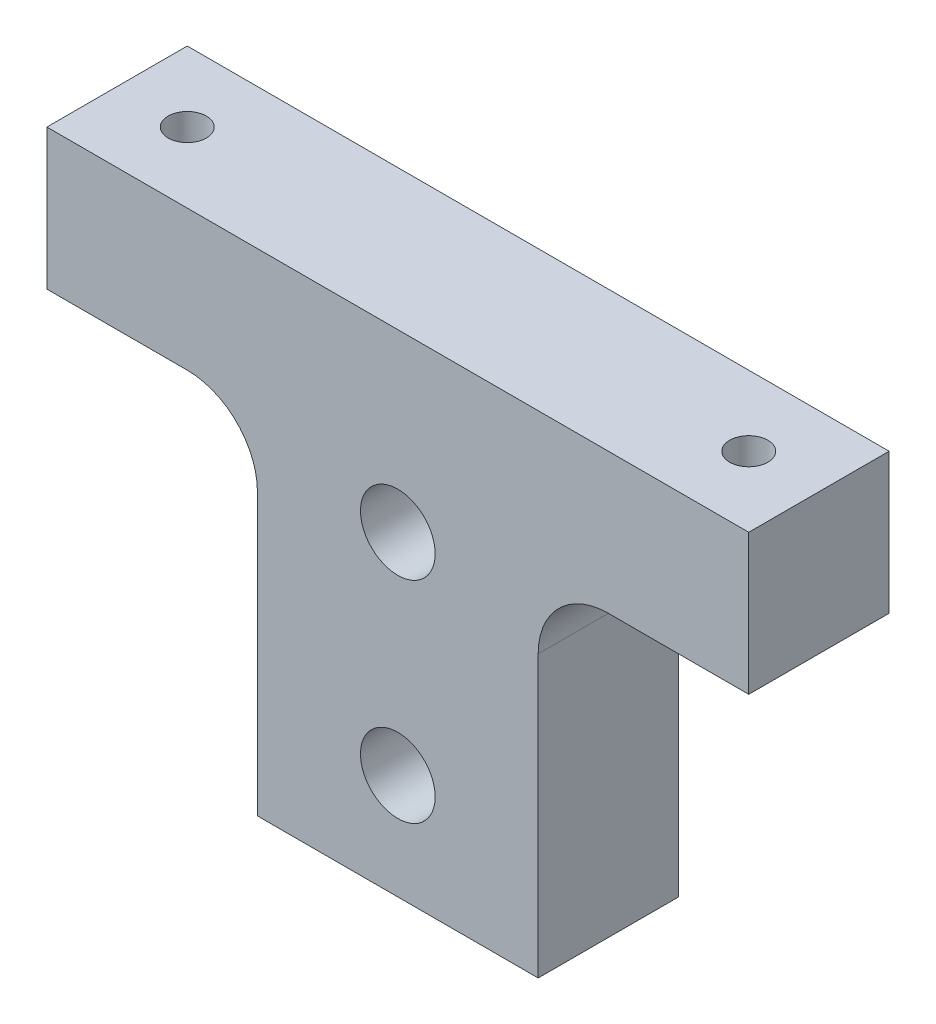
ISO-10303-21;
HEADER;
FILE_DESCRIPTION(('STEP AP214'),'2;1');
FILE_NAME('part.step','',(''),(''),'','','');
FILE_SCHEMA(('AUTOMOTIVE_DESIGN { 1 0 10303 214 1 1 1 1 }'));
ENDSEC;
DATA;
#1=APPLICATION_CONTEXT('core data for automotive mechanical design processes');
#2=APPLICATION_PROTOCOL_DEFINITION('international standard','automotive_design',2000,#1);
#3=PRODUCT_CONTEXT('',#1,'mechanical');
#4=PRODUCT('Part','Part','',(#3));
#5=PRODUCT_RELATED_PRODUCT_CATEGORY('part','',(#4));
#6=PRODUCT_DEFINITION_FORMATION('','',#4);
#7=PRODUCT_DEFINITION_CONTEXT('part definition',#1,'design');
#8=PRODUCT_DEFINITION('design','',#6,#7);
#9=PRODUCT_DEFINITION_SHAPE('','',#8);
#10=(LENGTH_UNIT() NAMED_UNIT(*) SI_UNIT(.MILLI.,.METRE.));
#11=(NAMED_UNIT(*) PLANE_ANGLE_UNIT() SI_UNIT($,.RADIAN.));
#12=(NAMED_UNIT(*) SI_UNIT($,.STERADIAN.) SOLID_ANGLE_UNIT());
#13=UNCERTAINTY_MEASURE_WITH_UNIT(LENGTH_MEASURE(1.E-05),#10,'distance_accuracy_value','');
#14=(GEOMETRIC_REPRESENTATION_CONTEXT(3) GLOBAL_UNCERTAINTY_ASSIGNED_CONTEXT((#13)) GLOBAL_UNIT_ASSIGNED_CONTEXT((#10,
#11,#12)) REPRESENTATION_CONTEXT('',''));
#15=CARTESIAN_POINT('',(0.,0.,0.));
#16=DIRECTION('',(0.,0.,1.));
#17=DIRECTION('',(1.,0.,0.));
#18=AXIS2_PLACEMENT_3D('',#15,#16,#17);
#19=CARTESIAN_POINT('',(12.7,15.875,12.7));
#20=DIRECTION('',(-1.,0.,0.));
#21=DIRECTION('',(0.,-1.,0.));
#22=AXIS2_PLACEMENT_3D('',#19,#20,#21);
#23=PLANE('',#22);
#24=DIRECTION('',(0.,1.,0.));
#25=VECTOR('',#24,1.);
#26=CARTESIAN_POINT('',(12.7,15.875,0.));
#27=LINE('',#26,#25);
#28=CARTESIAN_POINT('',(12.7,-15.875,0.));
#29=VERTEX_POINT('',#28);
#30=CARTESIAN_POINT('',(12.7,9.52499999999999,0.));
#31=VERTEX_POINT('',#30);
#32=EDGE_CURVE('E168',#29,#31,#27,.T.);
#33=ORIENTED_EDGE('',*,*,#32,.T.);
#34=DIRECTION('',(0.,0.,-1.));
#35=VECTOR('',#34,1.);
#36=CARTESIAN_POINT('',(12.7,9.52499999999999,12.7));
#37=LINE('',#36,#35);
#38=CARTESIAN_POINT('',(12.7,9.52499999999999,12.7));
#39=VERTEX_POINT('',#38);
#40=EDGE_CURVE('E59',#31,#39,#37,.F.);
#41=ORIENTED_EDGE('',*,*,#40,.T.);
#42=DIRECTION('',(0.,1.,0.));
#43=VECTOR('',#42,1.);
#44=CARTESIAN_POINT('',(12.7,15.875,12.7));
#45=LINE('',#44,#43);
#46=CARTESIAN_POINT('',(12.7,-15.875,12.7));
#47=VERTEX_POINT('',#46);
#48=EDGE_CURVE('E131',#47,#39,#45,.T.);
#49=ORIENTED_EDGE('',*,*,#48,.F.);
#50=DIRECTION('',(0.,0.,-1.));
#51=VECTOR('',#50,1.);
#52=CARTESIAN_POINT('',(12.7,-15.875,12.7));
#53=LINE('',#52,#51);
#54=EDGE_CURVE('E167',#47,#29,#53,.T.);
#55=ORIENTED_EDGE('',*,*,#54,.T.);
#56=EDGE_LOOP('',(#33,#41,#49,#55));
#57=FACE_BOUND('',#56,.T.);
#58=ADVANCED_FACE('F43',(#57),#23,.F.);
#59=CARTESIAN_POINT('',(12.7,15.875,12.7));
#60=DIRECTION('',(0.,1.,0.));
#61=DIRECTION('',(0.,0.,1.));
#62=AXIS2_PLACEMENT_3D('',#59,#60,#61);
#63=PLANE('',#62);
#64=CARTESIAN_POINT('',(25.4,15.875,6.35));
#65=DIRECTION('',(0.,-1.,0.));
#66=DIRECTION('',(0.,0.,-1.));
#67=AXIS2_PLACEMENT_3D('',#64,#65,#66);
#68=CIRCLE('',#67,1.7272);
#69=CARTESIAN_POINT('',(25.4,15.875,4.6228));
#70=VERTEX_POINT('',#69);
#71=EDGE_CURVE('E332',#70,#70,#68,.T.);
#72=ORIENTED_EDGE('',*,*,#71,.F.);
#73=EDGE_LOOP('',(#72));
#74=FACE_BOUND('',#73,.T.);
#75=DIRECTION('',(1.,0.,0.));
#76=VECTOR('',#75,1.);
#77=CARTESIAN_POINT('',(12.7,15.875,12.7));
#78=LINE('',#77,#76);
#79=CARTESIAN_POINT('',(19.05,15.875,12.7));
#80=VERTEX_POINT('',#79);
#81=CARTESIAN_POINT('',(31.75,15.875,12.7));
#82=VERTEX_POINT('',#81);
#83=EDGE_CURVE('E120',#80,#82,#78,.T.);
#84=ORIENTED_EDGE('',*,*,#83,.F.);
#85=DIRECTION('',(0.,0.,-1.));
#86=VECTOR('',#85,1.);
#87=CARTESIAN_POINT('',(19.05,15.875,0.));
#88=LINE('',#87,#86);
#89=CARTESIAN_POINT('',(19.05,15.875,0.));
#90=VERTEX_POINT('',#89);
#91=EDGE_CURVE('E216',#80,#90,#88,.T.);
#92=ORIENTED_EDGE('',*,*,#91,.T.);
#93=DIRECTION('',(1.,0.,0.));
#94=VECTOR('',#93,1.);
#95=CARTESIAN_POINT('',(12.7,15.875,0.));
#96=LINE('',#95,#94);
#97=CARTESIAN_POINT('',(31.75,15.875,0.));
#98=VERTEX_POINT('',#97);
#99=EDGE_CURVE('E136',#90,#98,#96,.T.);
#100=ORIENTED_EDGE('',*,*,#99,.T.);
#101=DIRECTION('',(0.,0.,-1.));
#102=VECTOR('',#101,1.);
#103=CARTESIAN_POINT('',(31.75,15.875,12.7));
#104=LINE('',#103,#102);
#105=EDGE_CURVE('E134',#82,#98,#104,.T.);
#106=ORIENTED_EDGE('',*,*,#105,.F.);
#107=EDGE_LOOP('',(#84,#92,#100,#106));
#108=FACE_BOUND('',#107,.T.);
#109=ADVANCED_FACE('F135',(#74,#108),#63,.F.);
#110=CARTESIAN_POINT('',(31.75,28.575,12.7));
#111=DIRECTION('',(-1.,0.,0.));
#112=DIRECTION('',(0.,0.,1.));
#113=AXIS2_PLACEMENT_3D('',#110,#111,#112);
#114=PLANE('',#113);
#115=DIRECTION('',(0.,1.,0.));
#116=VECTOR('',#115,1.);
#117=CARTESIAN_POINT('',(31.75,28.575,0.));
#118=LINE('',#117,#116);
#119=CARTESIAN_POINT('',(31.75,28.575,0.));
#120=VERTEX_POINT('',#119);
#121=EDGE_CURVE('E174',#98,#120,#118,.T.);
#122=ORIENTED_EDGE('',*,*,#121,.T.);
#123=DIRECTION('',(0.,0.,-1.));
#124=VECTOR('',#123,1.);
#125=CARTESIAN_POINT('',(31.75,28.575,12.7));
#126=LINE('',#125,#124);
#127=CARTESIAN_POINT('',(31.75,28.575,12.7));
#128=VERTEX_POINT('',#127);
#129=EDGE_CURVE('E141',#128,#120,#126,.T.);
#130=ORIENTED_EDGE('',*,*,#129,.F.);
#131=DIRECTION('',(0.,1.,0.));
#132=VECTOR('',#131,1.);
#133=CARTESIAN_POINT('',(31.75,28.575,12.7));
#134=LINE('',#133,#132);
#135=EDGE_CURVE('E124',#82,#128,#134,.T.);
#136=ORIENTED_EDGE('',*,*,#135,.F.);
#137=ORIENTED_EDGE('',*,*,#105,.T.);
#138=EDGE_LOOP('',(#122,#130,#136,#137));
#139=FACE_BOUND('',#138,.T.);
#140=ADVANCED_FACE('F143',(#139),#114,.F.);
#141=CARTESIAN_POINT('',(-31.75,28.575,12.7));
#142=DIRECTION('',(0.,-1.,0.));
#143=DIRECTION('',(0.,0.,-1.));
#144=AXIS2_PLACEMENT_3D('',#141,#142,#143);
#145=PLANE('',#144);
#146=CARTESIAN_POINT('',(25.4,28.575,6.35));
#147=DIRECTION('',(0.,-1.,0.));
#148=DIRECTION('',(0.,0.,-1.));
#149=AXIS2_PLACEMENT_3D('',#146,#147,#148);
#150=CIRCLE('',#149,1.7272);
#151=CARTESIAN_POINT('',(25.4,28.575,4.6228));
#152=VERTEX_POINT('',#151);
#153=EDGE_CURVE('E324',#152,#152,#150,.T.);
#154=ORIENTED_EDGE('',*,*,#153,.T.);
#155=EDGE_LOOP('',(#154));
#156=FACE_BOUND('',#155,.T.);
#157=CARTESIAN_POINT('',(-25.4,28.575,6.35));
#158=DIRECTION('',(0.,-1.,0.));
#159=DIRECTION('',(0.,0.,-1.));
#160=AXIS2_PLACEMENT_3D('',#157,#158,#159);
#161=CIRCLE('',#160,1.7272);
#162=CARTESIAN_POINT('',(-25.4,28.575,4.6228));
#163=VERTEX_POINT('',#162);
#164=EDGE_CURVE('E323',#163,#163,#161,.T.);
#165=ORIENTED_EDGE('',*,*,#164,.T.);
#166=EDGE_LOOP('',(#165));
#167=FACE_BOUND('',#166,.T.);
#168=DIRECTION('',(-1.,0.,0.));
#169=VECTOR('',#168,1.);
#170=CARTESIAN_POINT('',(-31.75,28.575,0.));
#171=LINE('',#170,#169);
#172=CARTESIAN_POINT('',(-31.75,28.575,0.));
#173=VERTEX_POINT('',#172);
#174=EDGE_CURVE('E177',#120,#173,#171,.T.);
#175=ORIENTED_EDGE('',*,*,#174,.T.);
#176=DIRECTION('',(0.,0.,-1.));
#177=VECTOR('',#176,1.);
#178=CARTESIAN_POINT('',(-31.75,28.575,12.7));
#179=LINE('',#178,#177);
#180=CARTESIAN_POINT('',(-31.75,28.575,12.7));
#181=VERTEX_POINT('',#180);
#182=EDGE_CURVE('E204',#181,#173,#179,.T.);
#183=ORIENTED_EDGE('',*,*,#182,.F.);
#184=DIRECTION('',(-1.,0.,0.));
#185=VECTOR('',#184,1.);
#186=CARTESIAN_POINT('',(-31.75,28.575,12.7));
#187=LINE('',#186,#185);
#188=EDGE_CURVE('E147',#128,#181,#187,.T.);
#189=ORIENTED_EDGE('',*,*,#188,.F.);
#190=ORIENTED_EDGE('',*,*,#129,.T.);
#191=EDGE_LOOP('',(#175,#183,#189,#190));
#192=FACE_BOUND('',#191,.T.);
#193=ADVANCED_FACE('F271',(#156,#167,#192),#145,.F.);
#194=CARTESIAN_POINT('',(-31.75,28.575,12.7));
#195=DIRECTION('',(1.,0.,0.));
#196=DIRECTION('',(0.,0.,-1.));
#197=AXIS2_PLACEMENT_3D('',#194,#195,#196);
#198=PLANE('',#197);
#199=DIRECTION('',(0.,-1.,0.));
#200=VECTOR('',#199,1.);
#201=CARTESIAN_POINT('',(-31.75,28.575,0.));
#202=LINE('',#201,#200);
#203=CARTESIAN_POINT('',(-31.75,15.875,0.));
#204=VERTEX_POINT('',#203);
#205=EDGE_CURVE('E180',#173,#204,#202,.T.);
#206=ORIENTED_EDGE('',*,*,#205,.T.);
#207=DIRECTION('',(0.,0.,-1.));
#208=VECTOR('',#207,1.);
#209=CARTESIAN_POINT('',(-31.75,15.875,12.7));
#210=LINE('',#209,#208);
#211=CARTESIAN_POINT('',(-31.75,15.875,12.7));
#212=VERTEX_POINT('',#211);
#213=EDGE_CURVE('E200',#212,#204,#210,.T.);
#214=ORIENTED_EDGE('',*,*,#213,.F.);
#215=DIRECTION('',(0.,-1.,0.));
#216=VECTOR('',#215,1.);
#217=CARTESIAN_POINT('',(-31.75,28.575,12.7));
#218=LINE('',#217,#216);
#219=EDGE_CURVE('E151',#181,#212,#218,.T.);
#220=ORIENTED_EDGE('',*,*,#219,.F.);
#221=ORIENTED_EDGE('',*,*,#182,.T.);
#222=EDGE_LOOP('',(#206,#214,#220,#221));
#223=FACE_BOUND('',#222,.T.);
#224=ADVANCED_FACE('F267',(#223),#198,.F.);
#225=CARTESIAN_POINT('',(-31.75,15.875,12.7));
#226=DIRECTION('',(0.,1.,0.));
#227=DIRECTION('',(0.,0.,1.));
#228=AXIS2_PLACEMENT_3D('',#225,#226,#227);
#229=PLANE('',#228);
#230=CARTESIAN_POINT('',(-25.4,15.875,6.35));
#231=DIRECTION('',(0.,-1.,0.));
#232=DIRECTION('',(0.,0.,-1.));
#233=AXIS2_PLACEMENT_3D('',#230,#231,#232);
#234=CIRCLE('',#233,1.7272);
#235=CARTESIAN_POINT('',(-25.4,15.875,4.6228));
#236=VERTEX_POINT('',#235);
#237=EDGE_CURVE('E320',#236,#236,#234,.T.);
#238=ORIENTED_EDGE('',*,*,#237,.F.);
#239=EDGE_LOOP('',(#238));
#240=FACE_BOUND('',#239,.T.);
#241=DIRECTION('',(1.,0.,0.));
#242=VECTOR('',#241,1.);
#243=CARTESIAN_POINT('',(-31.75,15.875,0.));
#244=LINE('',#243,#242);
#245=CARTESIAN_POINT('',(-19.05,15.875,0.));
#246=VERTEX_POINT('',#245);
#247=EDGE_CURVE('E183',#204,#246,#244,.T.);
#248=ORIENTED_EDGE('',*,*,#247,.T.);
#249=DIRECTION('',(0.,0.,-1.));
#250=VECTOR('',#249,1.);
#251=CARTESIAN_POINT('',(-19.05,15.875,12.7));
#252=LINE('',#251,#250);
#253=CARTESIAN_POINT('',(-19.05,15.875,12.7));
#254=VERTEX_POINT('',#253);
#255=EDGE_CURVE('E213',#246,#254,#252,.F.);
#256=ORIENTED_EDGE('',*,*,#255,.T.);
#257=DIRECTION('',(1.,0.,0.));
#258=VECTOR('',#257,1.);
#259=CARTESIAN_POINT('',(-31.75,15.875,12.7));
#260=LINE('',#259,#258);
#261=EDGE_CURVE('E157',#212,#254,#260,.T.);
#262=ORIENTED_EDGE('',*,*,#261,.F.);
#263=ORIENTED_EDGE('',*,*,#213,.T.);
#264=EDGE_LOOP('',(#248,#256,#262,#263));
#265=FACE_BOUND('',#264,.T.);
#266=ADVANCED_FACE('F263',(#240,#265),#229,.F.);
#267=CARTESIAN_POINT('',(-12.7,15.875,12.7));
#268=DIRECTION('',(1.,0.,0.));
#269=DIRECTION('',(0.,1.,0.));
#270=AXIS2_PLACEMENT_3D('',#267,#268,#269);
#271=PLANE('',#270);
#272=DIRECTION('',(0.,-1.,0.));
#273=VECTOR('',#272,1.);
#274=CARTESIAN_POINT('',(-12.7,15.875,12.7));
#275=LINE('',#274,#273);
#276=CARTESIAN_POINT('',(-12.7,9.52499999999999,12.7));
#277=VERTEX_POINT('',#276);
#278=CARTESIAN_POINT('',(-12.7,-15.875,12.7));
#279=VERTEX_POINT('',#278);
#280=EDGE_CURVE('E161',#277,#279,#275,.T.);
#281=ORIENTED_EDGE('',*,*,#280,.F.);
#282=DIRECTION('',(0.,0.,-1.));
#283=VECTOR('',#282,1.);
#284=CARTESIAN_POINT('',(-12.7,9.52499999999999,0.));
#285=LINE('',#284,#283);
#286=CARTESIAN_POINT('',(-12.7,9.52499999999999,0.));
#287=VERTEX_POINT('',#286);
#288=EDGE_CURVE('E140',#277,#287,#285,.T.);
#289=ORIENTED_EDGE('',*,*,#288,.T.);
#290=DIRECTION('',(0.,-1.,0.));
#291=VECTOR('',#290,1.);
#292=CARTESIAN_POINT('',(-12.7,15.875,0.));
#293=LINE('',#292,#291);
#294=CARTESIAN_POINT('',(-12.7,-15.875,0.));
#295=VERTEX_POINT('',#294);
#296=EDGE_CURVE('E187',#287,#295,#293,.T.);
#297=ORIENTED_EDGE('',*,*,#296,.T.);
#298=DIRECTION('',(0.,0.,-1.));
#299=VECTOR('',#298,1.);
#300=CARTESIAN_POINT('',(-12.7,-15.875,12.7));
#301=LINE('',#300,#299);
#302=EDGE_CURVE('E196',#279,#295,#301,.T.);
#303=ORIENTED_EDGE('',*,*,#302,.F.);
#304=EDGE_LOOP('',(#281,#289,#297,#303));
#305=FACE_BOUND('',#304,.T.);
#306=ADVANCED_FACE('F254',(#305),#271,.F.);
#307=CARTESIAN_POINT('',(-12.7,-15.875,12.7));
#308=DIRECTION('',(0.,1.,0.));
#309=DIRECTION('',(0.,0.,1.));
#310=AXIS2_PLACEMENT_3D('',#307,#308,#309);
#311=PLANE('',#310);
#312=DIRECTION('',(1.,0.,0.));
#313=VECTOR('',#312,1.);
#314=CARTESIAN_POINT('',(-12.7,-15.875,0.));
#315=LINE('',#314,#313);
#316=EDGE_CURVE('E190',#295,#29,#315,.T.);
#317=ORIENTED_EDGE('',*,*,#316,.T.);
#318=ORIENTED_EDGE('',*,*,#54,.F.);
#319=DIRECTION('',(1.,0.,0.));
#320=VECTOR('',#319,1.);
#321=CARTESIAN_POINT('',(-12.7,-15.875,12.7));
#322=LINE('',#321,#320);
#323=EDGE_CURVE('E164',#279,#47,#322,.T.);
#324=ORIENTED_EDGE('',*,*,#323,.F.);
#325=ORIENTED_EDGE('',*,*,#302,.T.);
#326=EDGE_LOOP('',(#317,#318,#324,#325));
#327=FACE_BOUND('',#326,.T.);
#328=ADVANCED_FACE('F302',(#327),#311,.F.);
#329=CARTESIAN_POINT('',(0.,0.,12.7));
#330=DIRECTION('',(0.,0.,1.));
#331=DIRECTION('',(1.,0.,0.));
#332=AXIS2_PLACEMENT_3D('',#329,#330,#331);
#333=PLANE('',#332);
#334=CARTESIAN_POINT('',(0.,-6.35000000000001,12.7));
#335=DIRECTION('',(0.,0.,1.));
#336=DIRECTION('',(1.,0.,0.));
#337=AXIS2_PLACEMENT_3D('',#334,#335,#336);
#338=CIRCLE('',#337,3.3782);
#339=CARTESIAN_POINT('',(3.3782,-6.35000000000001,12.7));
#340=VERTEX_POINT('',#339);
#341=EDGE_CURVE('E330',#340,#340,#338,.T.);
#342=ORIENTED_EDGE('',*,*,#341,.F.);
#343=EDGE_LOOP('',(#342));
#344=FACE_BOUND('',#343,.T.);
#345=CARTESIAN_POINT('',(0.,12.7,12.7));
#346=DIRECTION('',(0.,0.,1.));
#347=DIRECTION('',(1.,0.,0.));
#348=AXIS2_PLACEMENT_3D('',#345,#346,#347);
#349=CIRCLE('',#348,3.3782);
#350=CARTESIAN_POINT('',(3.3782,12.7,12.7));
#351=VERTEX_POINT('',#350);
#352=EDGE_CURVE('E342',#351,#351,#349,.T.);
#353=ORIENTED_EDGE('',*,*,#352,.F.);
#354=EDGE_LOOP('',(#353));
#355=FACE_BOUND('',#354,.T.);
#356=ORIENTED_EDGE('',*,*,#48,.T.);
#357=CARTESIAN_POINT('',(19.05,9.52499999999999,12.7));
#358=DIRECTION('',(0.,0.,1.));
#359=DIRECTION('',(1.,0.,0.));
#360=AXIS2_PLACEMENT_3D('',#357,#358,#359);
#361=CIRCLE('',#360,6.35);
#362=EDGE_CURVE('E11',#39,#80,#361,.F.);
#363=ORIENTED_EDGE('',*,*,#362,.T.);
#364=ORIENTED_EDGE('',*,*,#83,.T.);
#365=ORIENTED_EDGE('',*,*,#135,.T.);
#366=ORIENTED_EDGE('',*,*,#188,.T.);
#367=ORIENTED_EDGE('',*,*,#219,.T.);
#368=ORIENTED_EDGE('',*,*,#261,.T.);
#369=CARTESIAN_POINT('',(-19.05,9.52499999999999,12.7));
#370=DIRECTION('',(0.,0.,1.));
#371=DIRECTION('',(1.,0.,0.));
#372=AXIS2_PLACEMENT_3D('',#369,#370,#371);
#373=CIRCLE('',#372,6.35);
#374=EDGE_CURVE('E224',#254,#277,#373,.F.);
#375=ORIENTED_EDGE('',*,*,#374,.T.);
#376=ORIENTED_EDGE('',*,*,#280,.T.);
#377=ORIENTED_EDGE('',*,*,#323,.T.);
#378=EDGE_LOOP('',(#356,#363,#364,#365,#366,#367,#368,#375,#376,#377));
#379=FACE_BOUND('',#378,.T.);
#380=ADVANCED_FACE('F122',(#344,#355,#379),#333,.T.);
#381=CARTESIAN_POINT('',(0.,0.,0.));
#382=DIRECTION('',(0.,0.,1.));
#383=DIRECTION('',(1.,0.,0.));
#384=AXIS2_PLACEMENT_3D('',#381,#382,#383);
#385=PLANE('',#384);
#386=CARTESIAN_POINT('',(0.,-6.35000000000001,0.));
#387=DIRECTION('',(0.,0.,1.));
#388=DIRECTION('',(1.,0.,0.));
#389=AXIS2_PLACEMENT_3D('',#386,#387,#388);
#390=CIRCLE('',#389,3.3782);
#391=CARTESIAN_POINT('',(3.3782,-6.35000000000001,0.));
#392=VERTEX_POINT('',#391);
#393=EDGE_CURVE('E339',#392,#392,#390,.T.);
#394=ORIENTED_EDGE('',*,*,#393,.T.);
#395=EDGE_LOOP('',(#394));
#396=FACE_BOUND('',#395,.T.);
#397=CARTESIAN_POINT('',(0.,12.7,0.));
#398=DIRECTION('',(0.,0.,1.));
#399=DIRECTION('',(1.,0.,0.));
#400=AXIS2_PLACEMENT_3D('',#397,#398,#399);
#401=CIRCLE('',#400,3.3782);
#402=CARTESIAN_POINT('',(3.3782,12.7,0.));
#403=VERTEX_POINT('',#402);
#404=EDGE_CURVE('E171',#403,#403,#401,.T.);
#405=ORIENTED_EDGE('',*,*,#404,.T.);
#406=EDGE_LOOP('',(#405));
#407=FACE_BOUND('',#406,.T.);
#408=ORIENTED_EDGE('',*,*,#32,.F.);
#409=ORIENTED_EDGE('',*,*,#316,.F.);
#410=ORIENTED_EDGE('',*,*,#296,.F.);
#411=CARTESIAN_POINT('',(-19.05,9.52499999999999,0.));
#412=DIRECTION('',(0.,0.,1.));
#413=DIRECTION('',(1.,0.,0.));
#414=AXIS2_PLACEMENT_3D('',#411,#412,#413);
#415=CIRCLE('',#414,6.35);
#416=EDGE_CURVE('E221',#287,#246,#415,.T.);
#417=ORIENTED_EDGE('',*,*,#416,.T.);
#418=ORIENTED_EDGE('',*,*,#247,.F.);
#419=ORIENTED_EDGE('',*,*,#205,.F.);
#420=ORIENTED_EDGE('',*,*,#174,.F.);
#421=ORIENTED_EDGE('',*,*,#121,.F.);
#422=ORIENTED_EDGE('',*,*,#99,.F.);
#423=CARTESIAN_POINT('',(19.05,9.52499999999999,0.));
#424=DIRECTION('',(0.,0.,1.));
#425=DIRECTION('',(1.,0.,0.));
#426=AXIS2_PLACEMENT_3D('',#423,#424,#425);
#427=CIRCLE('',#426,6.35);
#428=EDGE_CURVE('E52',#90,#31,#427,.T.);
#429=ORIENTED_EDGE('',*,*,#428,.T.);
#430=EDGE_LOOP('',(#408,#409,#410,#417,#418,#419,#420,#421,#422,#429));
#431=FACE_BOUND('',#430,.T.);
#432=ADVANCED_FACE('F259',(#396,#407,#431),#385,.F.);
#433=CARTESIAN_POINT('',(-19.05,9.52499999999999,12.7));
#434=DIRECTION('',(0.,0.,1.));
#435=DIRECTION('',(1.,0.,0.));
#436=AXIS2_PLACEMENT_3D('',#433,#434,#435);
#437=CYLINDRICAL_SURFACE('',#436,6.35);
#438=ORIENTED_EDGE('',*,*,#374,.F.);
#439=ORIENTED_EDGE('',*,*,#255,.F.);
#440=ORIENTED_EDGE('',*,*,#416,.F.);
#441=ORIENTED_EDGE('',*,*,#288,.F.);
#442=EDGE_LOOP('',(#438,#439,#440,#441));
#443=FACE_BOUND('',#442,.T.);
#444=ADVANCED_FACE('F257',(#443),#437,.F.);
#445=CARTESIAN_POINT('',(19.05,9.52499999999999,12.7));
#446=DIRECTION('',(0.,0.,1.));
#447=DIRECTION('',(1.,0.,0.));
#448=AXIS2_PLACEMENT_3D('',#445,#446,#447);
#449=CYLINDRICAL_SURFACE('',#448,6.35);
#450=ORIENTED_EDGE('',*,*,#362,.F.);
#451=ORIENTED_EDGE('',*,*,#40,.F.);
#452=ORIENTED_EDGE('',*,*,#428,.F.);
#453=ORIENTED_EDGE('',*,*,#91,.F.);
#454=EDGE_LOOP('',(#450,#451,#452,#453));
#455=FACE_BOUND('',#454,.T.);
#456=ADVANCED_FACE('F45',(#455),#449,.F.);
#457=CARTESIAN_POINT('',(0.,12.7,12.7));
#458=DIRECTION('',(0.,0.,1.));
#459=DIRECTION('',(1.,0.,0.));
#460=AXIS2_PLACEMENT_3D('',#457,#458,#459);
#461=CYLINDRICAL_SURFACE('',#460,3.3782);
#462=ORIENTED_EDGE('',*,*,#404,.F.);
#463=EDGE_LOOP('',(#462));
#464=FACE_BOUND('',#463,.T.);
#465=ORIENTED_EDGE('',*,*,#352,.T.);
#466=EDGE_LOOP('',(#465));
#467=FACE_BOUND('',#466,.T.);
#468=ADVANCED_FACE('F295',(#464,#467),#461,.F.);
#469=CARTESIAN_POINT('',(0.,-6.35000000000001,12.7));
#470=DIRECTION('',(0.,0.,1.));
#471=DIRECTION('',(1.,0.,0.));
#472=AXIS2_PLACEMENT_3D('',#469,#470,#471);
#473=CYLINDRICAL_SURFACE('',#472,3.3782);
#474=ORIENTED_EDGE('',*,*,#393,.F.);
#475=EDGE_LOOP('',(#474));
#476=FACE_BOUND('',#475,.T.);
#477=ORIENTED_EDGE('',*,*,#341,.T.);
#478=EDGE_LOOP('',(#477));
#479=FACE_BOUND('',#478,.T.);
#480=ADVANCED_FACE('F369',(#476,#479),#473,.F.);
#481=CARTESIAN_POINT('',(-25.4,15.875,6.35));
#482=DIRECTION('',(0.,-1.,0.));
#483=DIRECTION('',(0.,0.,-1.));
#484=AXIS2_PLACEMENT_3D('',#481,#482,#483);
#485=CYLINDRICAL_SURFACE('',#484,1.7272);
#486=ORIENTED_EDGE('',*,*,#164,.F.);
#487=EDGE_LOOP('',(#486));
#488=FACE_BOUND('',#487,.T.);
#489=ORIENTED_EDGE('',*,*,#237,.T.);
#490=EDGE_LOOP('',(#489));
#491=FACE_BOUND('',#490,.T.);
#492=ADVANCED_FACE('F375',(#488,#491),#485,.F.);
#493=CARTESIAN_POINT('',(25.4,15.875,6.35));
#494=DIRECTION('',(0.,-1.,0.));
#495=DIRECTION('',(0.,0.,-1.));
#496=AXIS2_PLACEMENT_3D('',#493,#494,#495);
#497=CYLINDRICAL_SURFACE('',#496,1.7272);
#498=ORIENTED_EDGE('',*,*,#153,.F.);
#499=EDGE_LOOP('',(#498));
#500=FACE_BOUND('',#499,.T.);
#501=ORIENTED_EDGE('',*,*,#71,.T.);
#502=EDGE_LOOP('',(#501));
#503=FACE_BOUND('',#502,.T.);
#504=ADVANCED_FACE('F381',(#500,#503),#497,.F.);
#505=CLOSED_SHELL('',(#58,#109,#140,#193,#224,#266,#306,#328,#380,#432,#444,#456,#468,#480,#492,#504));
#506=MANIFOLD_SOLID_BREP('B2',#505);
#507=ADVANCED_BREP_SHAPE_REPRESENTATION('',(#18,#506),#14);
#508=SHAPE_DEFINITION_REPRESENTATION(#9,#507);
ENDSEC;
END-ISO-10303-21;
